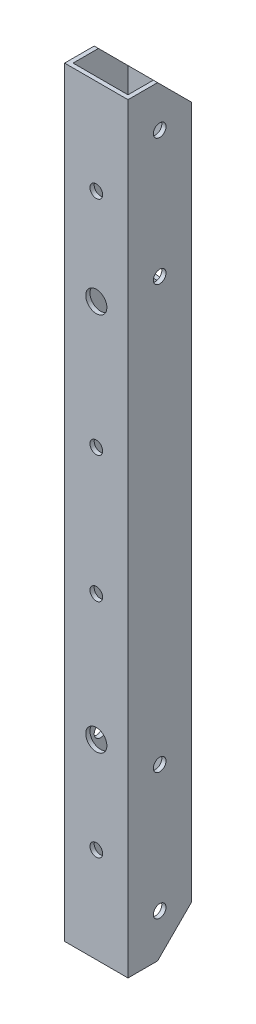
ISO-10303-21;
HEADER;
FILE_DESCRIPTION(('STEP AP214'),'2;1');
FILE_NAME('part.step','',(''),(''),'','','');
FILE_SCHEMA(('AUTOMOTIVE_DESIGN { 1 0 10303 214 1 1 1 1 }'));
ENDSEC;
DATA;
#1=APPLICATION_CONTEXT('core data for automotive mechanical design processes');
#2=APPLICATION_PROTOCOL_DEFINITION('international standard','automotive_design',2000,#1);
#3=PRODUCT_CONTEXT('',#1,'mechanical');
#4=PRODUCT('Part','Part','',(#3));
#5=PRODUCT_RELATED_PRODUCT_CATEGORY('part','',(#4));
#6=PRODUCT_DEFINITION_FORMATION('','',#4);
#7=PRODUCT_DEFINITION_CONTEXT('part definition',#1,'design');
#8=PRODUCT_DEFINITION('design','',#6,#7);
#9=PRODUCT_DEFINITION_SHAPE('','',#8);
#10=(LENGTH_UNIT() NAMED_UNIT(*) SI_UNIT(.MILLI.,.METRE.));
#11=(NAMED_UNIT(*) PLANE_ANGLE_UNIT() SI_UNIT($,.RADIAN.));
#12=(NAMED_UNIT(*) SI_UNIT($,.STERADIAN.) SOLID_ANGLE_UNIT());
#13=UNCERTAINTY_MEASURE_WITH_UNIT(LENGTH_MEASURE(1.E-05),#10,'distance_accuracy_value','');
#14=(GEOMETRIC_REPRESENTATION_CONTEXT(3) GLOBAL_UNCERTAINTY_ASSIGNED_CONTEXT((#13)) GLOBAL_UNIT_ASSIGNED_CONTEXT((#10,
#11,#12)) REPRESENTATION_CONTEXT('',''));
#15=CARTESIAN_POINT('',(0.,0.,0.));
#16=DIRECTION('',(0.,0.,1.));
#17=DIRECTION('',(1.,0.,0.));
#18=AXIS2_PLACEMENT_3D('',#15,#16,#17);
#19=CARTESIAN_POINT('',(0.,180.,0.));
#20=DIRECTION('',(0.,-1.,0.));
#21=DIRECTION('',(0.,0.,-1.));
#22=AXIS2_PLACEMENT_3D('',#19,#20,#21);
#23=PLANE('',#22);
#24=DIRECTION('',(0.,0.,-1.));
#25=VECTOR('',#24,1.);
#26=CARTESIAN_POINT('',(7.5,180.,7.5));
#27=LINE('',#26,#25);
#28=CARTESIAN_POINT('',(7.5,180.,7.5));
#29=VERTEX_POINT('',#28);
#30=CARTESIAN_POINT('',(7.5,180.,0.500000000000093));
#31=VERTEX_POINT('',#30);
#32=EDGE_CURVE('E288',#29,#31,#27,.T.);
#33=ORIENTED_EDGE('',*,*,#32,.T.);
#34=DIRECTION('',(1.,0.,0.));
#35=VECTOR('',#34,1.);
#36=CARTESIAN_POINT('',(-7.5,180.,0.500000000000093));
#37=LINE('',#36,#35);
#38=CARTESIAN_POINT('',(6.5,180.,0.500000000000093));
#39=VERTEX_POINT('',#38);
#40=EDGE_CURVE('E133',#39,#31,#37,.T.);
#41=ORIENTED_EDGE('',*,*,#40,.F.);
#42=DIRECTION('',(0.,0.,-1.));
#43=VECTOR('',#42,1.);
#44=CARTESIAN_POINT('',(6.5,180.,6.5));
#45=LINE('',#44,#43);
#46=CARTESIAN_POINT('',(6.5,180.,6.5));
#47=VERTEX_POINT('',#46);
#48=EDGE_CURVE('E267',#47,#39,#45,.T.);
#49=ORIENTED_EDGE('',*,*,#48,.F.);
#50=DIRECTION('',(1.,0.,0.));
#51=VECTOR('',#50,1.);
#52=CARTESIAN_POINT('',(-6.5,180.,6.5));
#53=LINE('',#52,#51);
#54=CARTESIAN_POINT('',(-6.5,180.,6.5));
#55=VERTEX_POINT('',#54);
#56=EDGE_CURVE('E264',#55,#47,#53,.T.);
#57=ORIENTED_EDGE('',*,*,#56,.F.);
#58=DIRECTION('',(0.,0.,1.));
#59=VECTOR('',#58,1.);
#60=CARTESIAN_POINT('',(-6.5,180.,6.5));
#61=LINE('',#60,#59);
#62=CARTESIAN_POINT('',(-6.5,180.,0.500000000000093));
#63=VERTEX_POINT('',#62);
#64=EDGE_CURVE('E262',#63,#55,#61,.T.);
#65=ORIENTED_EDGE('',*,*,#64,.F.);
#66=CARTESIAN_POINT('',(-7.5,180.,0.500000000000093));
#67=VERTEX_POINT('',#66);
#68=EDGE_CURVE('E330',#67,#63,#37,.T.);
#69=ORIENTED_EDGE('',*,*,#68,.F.);
#70=DIRECTION('',(0.,0.,1.));
#71=VECTOR('',#70,1.);
#72=CARTESIAN_POINT('',(-7.5,180.,7.5));
#73=LINE('',#72,#71);
#74=CARTESIAN_POINT('',(-7.5,180.,7.5));
#75=VERTEX_POINT('',#74);
#76=EDGE_CURVE('E142',#67,#75,#73,.T.);
#77=ORIENTED_EDGE('',*,*,#76,.T.);
#78=DIRECTION('',(1.,0.,0.));
#79=VECTOR('',#78,1.);
#80=CARTESIAN_POINT('',(-7.5,180.,7.5));
#81=LINE('',#80,#79);
#82=EDGE_CURVE('E293',#75,#29,#81,.T.);
#83=ORIENTED_EDGE('',*,*,#82,.T.);
#84=EDGE_LOOP('',(#33,#41,#49,#57,#65,#69,#77,#83));
#85=FACE_BOUND('',#84,.T.);
#86=ADVANCED_FACE('F34',(#85),#23,.F.);
#87=CARTESIAN_POINT('',(0.,0.,0.));
#88=DIRECTION('',(0.,-1.,0.));
#89=DIRECTION('',(0.,0.,-1.));
#90=AXIS2_PLACEMENT_3D('',#87,#88,#89);
#91=PLANE('',#90);
#92=DIRECTION('',(1.,0.,0.));
#93=VECTOR('',#92,1.);
#94=CARTESIAN_POINT('',(-7.5,0.,0.500000000000101));
#95=LINE('',#94,#93);
#96=CARTESIAN_POINT('',(6.5,0.,0.500000000000101));
#97=VERTEX_POINT('',#96);
#98=CARTESIAN_POINT('',(7.5,0.,0.500000000000101));
#99=VERTEX_POINT('',#98);
#100=EDGE_CURVE('E312',#97,#99,#95,.T.);
#101=ORIENTED_EDGE('',*,*,#100,.T.);
#102=DIRECTION('',(0.,0.,-1.));
#103=VECTOR('',#102,1.);
#104=CARTESIAN_POINT('',(7.5,0.,7.5));
#105=LINE('',#104,#103);
#106=CARTESIAN_POINT('',(7.5,0.,7.5));
#107=VERTEX_POINT('',#106);
#108=EDGE_CURVE('E287',#107,#99,#105,.T.);
#109=ORIENTED_EDGE('',*,*,#108,.F.);
#110=DIRECTION('',(1.,0.,0.));
#111=VECTOR('',#110,1.);
#112=CARTESIAN_POINT('',(-7.5,0.,7.5));
#113=LINE('',#112,#111);
#114=CARTESIAN_POINT('',(-7.5,0.,7.5));
#115=VERTEX_POINT('',#114);
#116=EDGE_CURVE('E291',#115,#107,#113,.T.);
#117=ORIENTED_EDGE('',*,*,#116,.F.);
#118=DIRECTION('',(0.,0.,1.));
#119=VECTOR('',#118,1.);
#120=CARTESIAN_POINT('',(-7.5,0.,7.5));
#121=LINE('',#120,#119);
#122=CARTESIAN_POINT('',(-7.5,0.,0.500000000000101));
#123=VERTEX_POINT('',#122);
#124=EDGE_CURVE('E297',#123,#115,#121,.T.);
#125=ORIENTED_EDGE('',*,*,#124,.F.);
#126=CARTESIAN_POINT('',(-6.5,0.,0.500000000000101));
#127=VERTEX_POINT('',#126);
#128=EDGE_CURVE('E314',#123,#127,#95,.T.);
#129=ORIENTED_EDGE('',*,*,#128,.T.);
#130=DIRECTION('',(0.,0.,1.));
#131=VECTOR('',#130,1.);
#132=CARTESIAN_POINT('',(-6.5,0.,6.5));
#133=LINE('',#132,#131);
#134=CARTESIAN_POINT('',(-6.5,0.,6.5));
#135=VERTEX_POINT('',#134);
#136=EDGE_CURVE('E261',#127,#135,#133,.T.);
#137=ORIENTED_EDGE('',*,*,#136,.T.);
#138=DIRECTION('',(1.,0.,0.));
#139=VECTOR('',#138,1.);
#140=CARTESIAN_POINT('',(-6.5,0.,6.5));
#141=LINE('',#140,#139);
#142=CARTESIAN_POINT('',(6.5,0.,6.5));
#143=VERTEX_POINT('',#142);
#144=EDGE_CURVE('E272',#135,#143,#141,.T.);
#145=ORIENTED_EDGE('',*,*,#144,.T.);
#146=DIRECTION('',(0.,0.,-1.));
#147=VECTOR('',#146,1.);
#148=CARTESIAN_POINT('',(6.5,0.,6.5));
#149=LINE('',#148,#147);
#150=EDGE_CURVE('E265',#143,#97,#149,.T.);
#151=ORIENTED_EDGE('',*,*,#150,.T.);
#152=EDGE_LOOP('',(#101,#109,#117,#125,#129,#137,#145,#151));
#153=FACE_BOUND('',#152,.T.);
#154=ADVANCED_FACE('F310',(#153),#91,.T.);
#155=CARTESIAN_POINT('',(7.5,180.,7.5));
#156=DIRECTION('',(-1.,0.,0.));
#157=DIRECTION('',(0.,0.,1.));
#158=AXIS2_PLACEMENT_3D('',#155,#156,#157);
#159=PLANE('',#158);
#160=CARTESIAN_POINT('',(7.5,40.,0.));
#161=DIRECTION('',(1.,0.,0.));
#162=DIRECTION('',(0.,0.,1.));
#163=AXIS2_PLACEMENT_3D('',#160,#161,#162);
#164=CIRCLE('',#163,1.5);
#165=CARTESIAN_POINT('',(7.5,40.,1.5));
#166=VERTEX_POINT('',#165);
#167=EDGE_CURVE('E327',#166,#166,#164,.T.);
#168=ORIENTED_EDGE('',*,*,#167,.F.);
#169=EDGE_LOOP('',(#168));
#170=FACE_BOUND('',#169,.T.);
#171=CARTESIAN_POINT('',(7.5,10.,0.));
#172=DIRECTION('',(1.,0.,0.));
#173=DIRECTION('',(0.,0.,1.));
#174=AXIS2_PLACEMENT_3D('',#171,#172,#173);
#175=CIRCLE('',#174,1.5);
#176=CARTESIAN_POINT('',(7.5,10.,1.5));
#177=VERTEX_POINT('',#176);
#178=EDGE_CURVE('E326',#177,#177,#175,.T.);
#179=ORIENTED_EDGE('',*,*,#178,.F.);
#180=EDGE_LOOP('',(#179));
#181=FACE_BOUND('',#180,.T.);
#182=CARTESIAN_POINT('',(7.5,140.,0.));
#183=DIRECTION('',(1.,0.,0.));
#184=DIRECTION('',(0.,0.,-1.));
#185=AXIS2_PLACEMENT_3D('',#182,#183,#184);
#186=CIRCLE('',#185,1.5);
#187=CARTESIAN_POINT('',(7.5,140.,-1.50000000000001));
#188=VERTEX_POINT('',#187);
#189=EDGE_CURVE('E334',#188,#188,#186,.T.);
#190=ORIENTED_EDGE('',*,*,#189,.F.);
#191=EDGE_LOOP('',(#190));
#192=FACE_BOUND('',#191,.T.);
#193=CARTESIAN_POINT('',(7.5,170.,0.));
#194=DIRECTION('',(1.,0.,0.));
#195=DIRECTION('',(0.,0.,-1.));
#196=AXIS2_PLACEMENT_3D('',#193,#194,#195);
#197=CIRCLE('',#196,1.5);
#198=CARTESIAN_POINT('',(7.5,170.,-1.50000000000001));
#199=VERTEX_POINT('',#198);
#200=EDGE_CURVE('E208',#199,#199,#197,.T.);
#201=ORIENTED_EDGE('',*,*,#200,.F.);
#202=EDGE_LOOP('',(#201));
#203=FACE_BOUND('',#202,.T.);
#204=DIRECTION('',(0.,-1.,0.));
#205=VECTOR('',#204,1.);
#206=CARTESIAN_POINT('',(7.5,180.,-7.5));
#207=LINE('',#206,#205);
#208=CARTESIAN_POINT('',(7.5,172.,-7.5));
#209=VERTEX_POINT('',#208);
#210=CARTESIAN_POINT('',(7.5,8.00000000000001,-7.5));
#211=VERTEX_POINT('',#210);
#212=EDGE_CURVE('E147',#209,#211,#207,.T.);
#213=ORIENTED_EDGE('',*,*,#212,.F.);
#214=DIRECTION('',(0.,-0.707106781186544,-0.707106781186551));
#215=VECTOR('',#214,1.);
#216=CARTESIAN_POINT('',(7.5,180.,0.500000000000093));
#217=LINE('',#216,#215);
#218=EDGE_CURVE('E128',#31,#209,#217,.T.);
#219=ORIENTED_EDGE('',*,*,#218,.F.);
#220=ORIENTED_EDGE('',*,*,#32,.F.);
#221=DIRECTION('',(0.,-1.,0.));
#222=VECTOR('',#221,1.);
#223=CARTESIAN_POINT('',(7.5,180.,7.5));
#224=LINE('',#223,#222);
#225=EDGE_CURVE('E152',#29,#107,#224,.T.);
#226=ORIENTED_EDGE('',*,*,#225,.T.);
#227=ORIENTED_EDGE('',*,*,#108,.T.);
#228=DIRECTION('',(0.,-0.707106781186543,0.707106781186552));
#229=VECTOR('',#228,1.);
#230=CARTESIAN_POINT('',(7.5,0.,0.500000000000101));
#231=LINE('',#230,#229);
#232=EDGE_CURVE('E320',#211,#99,#231,.T.);
#233=ORIENTED_EDGE('',*,*,#232,.F.);
#234=EDGE_LOOP('',(#213,#219,#220,#226,#227,#233));
#235=FACE_BOUND('',#234,.T.);
#236=ADVANCED_FACE('F36',(#170,#181,#192,#203,#235),#159,.F.);
#237=CARTESIAN_POINT('',(-7.5,180.,-7.5));
#238=DIRECTION('',(0.,0.,1.));
#239=DIRECTION('',(1.,0.,0.));
#240=AXIS2_PLACEMENT_3D('',#237,#238,#239);
#241=PLANE('',#240);
#242=CARTESIAN_POINT('',(0.,75.,-7.5));
#243=DIRECTION('',(0.,0.,1.));
#244=DIRECTION('',(1.,0.,0.));
#245=AXIS2_PLACEMENT_3D('',#242,#243,#244);
#246=CIRCLE('',#245,1.5);
#247=CARTESIAN_POINT('',(1.50000000000001,75.,-7.5));
#248=VERTEX_POINT('',#247);
#249=EDGE_CURVE('E229',#248,#248,#246,.T.);
#250=ORIENTED_EDGE('',*,*,#249,.T.);
#251=EDGE_LOOP('',(#250));
#252=FACE_BOUND('',#251,.T.);
#253=CARTESIAN_POINT('',(0.,105.,-7.5));
#254=DIRECTION('',(0.,0.,1.));
#255=DIRECTION('',(1.,0.,0.));
#256=AXIS2_PLACEMENT_3D('',#253,#254,#255);
#257=CIRCLE('',#256,1.5);
#258=CARTESIAN_POINT('',(1.50000000000001,105.,-7.5));
#259=VERTEX_POINT('',#258);
#260=EDGE_CURVE('E223',#259,#259,#257,.T.);
#261=ORIENTED_EDGE('',*,*,#260,.T.);
#262=EDGE_LOOP('',(#261));
#263=FACE_BOUND('',#262,.T.);
#264=CARTESIAN_POINT('',(0.,22.5,-7.5));
#265=DIRECTION('',(0.,0.,1.));
#266=DIRECTION('',(-1.,0.,0.));
#267=AXIS2_PLACEMENT_3D('',#264,#265,#266);
#268=CIRCLE('',#267,1.5);
#269=CARTESIAN_POINT('',(-1.49999999999998,22.5,-7.5));
#270=VERTEX_POINT('',#269);
#271=EDGE_CURVE('E216',#270,#270,#268,.T.);
#272=ORIENTED_EDGE('',*,*,#271,.T.);
#273=EDGE_LOOP('',(#272));
#274=FACE_BOUND('',#273,.T.);
#275=CARTESIAN_POINT('',(0.,157.5,-7.5));
#276=DIRECTION('',(0.,0.,1.));
#277=DIRECTION('',(1.,0.,0.));
#278=AXIS2_PLACEMENT_3D('',#275,#276,#277);
#279=CIRCLE('',#278,1.5);
#280=CARTESIAN_POINT('',(1.50000000000002,157.5,-7.5));
#281=VERTEX_POINT('',#280);
#282=EDGE_CURVE('E239',#281,#281,#279,.T.);
#283=ORIENTED_EDGE('',*,*,#282,.T.);
#284=EDGE_LOOP('',(#283));
#285=FACE_BOUND('',#284,.T.);
#286=CARTESIAN_POINT('',(0.,45.0987193946542,-7.5));
#287=DIRECTION('',(0.,0.,1.));
#288=DIRECTION('',(1.,0.,0.));
#289=AXIS2_PLACEMENT_3D('',#286,#287,#288);
#290=CIRCLE('',#289,2.5);
#291=CARTESIAN_POINT('',(2.49999999999999,45.0987193946542,-7.5));
#292=VERTEX_POINT('',#291);
#293=EDGE_CURVE('E165',#292,#292,#290,.T.);
#294=ORIENTED_EDGE('',*,*,#293,.T.);
#295=EDGE_LOOP('',(#294));
#296=FACE_BOUND('',#295,.T.);
#297=CARTESIAN_POINT('',(0.,134.901280605346,-7.5));
#298=DIRECTION('',(0.,0.,1.));
#299=DIRECTION('',(1.,0.,0.));
#300=AXIS2_PLACEMENT_3D('',#297,#298,#299);
#301=CIRCLE('',#300,2.5);
#302=CARTESIAN_POINT('',(2.49999999999999,134.901280605346,-7.5));
#303=VERTEX_POINT('',#302);
#304=EDGE_CURVE('E160',#303,#303,#301,.T.);
#305=ORIENTED_EDGE('',*,*,#304,.T.);
#306=EDGE_LOOP('',(#305));
#307=FACE_BOUND('',#306,.T.);
#308=DIRECTION('',(0.,-1.,0.));
#309=VECTOR('',#308,1.);
#310=CARTESIAN_POINT('',(-7.5,180.,-7.5));
#311=LINE('',#310,#309);
#312=CARTESIAN_POINT('',(-7.5,172.,-7.5));
#313=VERTEX_POINT('',#312);
#314=CARTESIAN_POINT('',(-7.5,8.00000000000001,-7.5));
#315=VERTEX_POINT('',#314);
#316=EDGE_CURVE('E140',#313,#315,#311,.T.);
#317=ORIENTED_EDGE('',*,*,#316,.F.);
#318=DIRECTION('',(1.,0.,0.));
#319=VECTOR('',#318,1.);
#320=CARTESIAN_POINT('',(-7.5,172.,-7.5));
#321=LINE('',#320,#319);
#322=EDGE_CURVE('E122',#313,#209,#321,.T.);
#323=ORIENTED_EDGE('',*,*,#322,.T.);
#324=ORIENTED_EDGE('',*,*,#212,.T.);
#325=DIRECTION('',(1.,0.,0.));
#326=VECTOR('',#325,1.);
#327=CARTESIAN_POINT('',(-7.5,8.00000000000001,-7.5));
#328=LINE('',#327,#326);
#329=EDGE_CURVE('E146',#315,#211,#328,.T.);
#330=ORIENTED_EDGE('',*,*,#329,.F.);
#331=EDGE_LOOP('',(#317,#323,#324,#330));
#332=FACE_BOUND('',#331,.T.);
#333=ADVANCED_FACE('F145',(#252,#263,#274,#285,#296,#307,#332),#241,.F.);
#334=CARTESIAN_POINT('',(-7.5,180.,7.5));
#335=DIRECTION('',(1.,0.,0.));
#336=DIRECTION('',(0.,0.,-1.));
#337=AXIS2_PLACEMENT_3D('',#334,#335,#336);
#338=PLANE('',#337);
#339=CARTESIAN_POINT('',(-7.5,40.,0.));
#340=DIRECTION('',(1.,0.,0.));
#341=DIRECTION('',(0.,0.,1.));
#342=AXIS2_PLACEMENT_3D('',#339,#340,#341);
#343=CIRCLE('',#342,1.5);
#344=CARTESIAN_POINT('',(-7.5,40.,1.5));
#345=VERTEX_POINT('',#344);
#346=EDGE_CURVE('E323',#345,#345,#343,.T.);
#347=ORIENTED_EDGE('',*,*,#346,.T.);
#348=EDGE_LOOP('',(#347));
#349=FACE_BOUND('',#348,.T.);
#350=CARTESIAN_POINT('',(-7.5,10.,0.));
#351=DIRECTION('',(1.,0.,0.));
#352=DIRECTION('',(0.,0.,1.));
#353=AXIS2_PLACEMENT_3D('',#350,#351,#352);
#354=CIRCLE('',#353,1.5);
#355=CARTESIAN_POINT('',(-7.5,10.,1.5));
#356=VERTEX_POINT('',#355);
#357=EDGE_CURVE('E337',#356,#356,#354,.T.);
#358=ORIENTED_EDGE('',*,*,#357,.T.);
#359=EDGE_LOOP('',(#358));
#360=FACE_BOUND('',#359,.T.);
#361=CARTESIAN_POINT('',(-7.5,140.,0.));
#362=DIRECTION('',(1.,0.,0.));
#363=DIRECTION('',(0.,0.,-1.));
#364=AXIS2_PLACEMENT_3D('',#361,#362,#363);
#365=CIRCLE('',#364,1.5);
#366=CARTESIAN_POINT('',(-7.5,140.,-1.50000000000001));
#367=VERTEX_POINT('',#366);
#368=EDGE_CURVE('E331',#367,#367,#365,.T.);
#369=ORIENTED_EDGE('',*,*,#368,.T.);
#370=EDGE_LOOP('',(#369));
#371=FACE_BOUND('',#370,.T.);
#372=CARTESIAN_POINT('',(-7.5,170.,0.));
#373=DIRECTION('',(1.,0.,0.));
#374=DIRECTION('',(0.,0.,-1.));
#375=AXIS2_PLACEMENT_3D('',#372,#373,#374);
#376=CIRCLE('',#375,1.5);
#377=CARTESIAN_POINT('',(-7.5,170.,-1.50000000000001));
#378=VERTEX_POINT('',#377);
#379=EDGE_CURVE('E186',#378,#378,#376,.T.);
#380=ORIENTED_EDGE('',*,*,#379,.T.);
#381=EDGE_LOOP('',(#380));
#382=FACE_BOUND('',#381,.T.);
#383=ORIENTED_EDGE('',*,*,#76,.F.);
#384=DIRECTION('',(0.,-0.707106781186544,-0.707106781186551));
#385=VECTOR('',#384,1.);
#386=CARTESIAN_POINT('',(-7.5,180.,0.500000000000093));
#387=LINE('',#386,#385);
#388=EDGE_CURVE('E125',#67,#313,#387,.T.);
#389=ORIENTED_EDGE('',*,*,#388,.T.);
#390=ORIENTED_EDGE('',*,*,#316,.T.);
#391=DIRECTION('',(0.,-0.707106781186543,0.707106781186552));
#392=VECTOR('',#391,1.);
#393=CARTESIAN_POINT('',(-7.5,0.,0.500000000000101));
#394=LINE('',#393,#392);
#395=EDGE_CURVE('E317',#315,#123,#394,.T.);
#396=ORIENTED_EDGE('',*,*,#395,.T.);
#397=ORIENTED_EDGE('',*,*,#124,.T.);
#398=DIRECTION('',(0.,-1.,0.));
#399=VECTOR('',#398,1.);
#400=CARTESIAN_POINT('',(-7.5,180.,7.5));
#401=LINE('',#400,#399);
#402=EDGE_CURVE('E148',#75,#115,#401,.T.);
#403=ORIENTED_EDGE('',*,*,#402,.F.);
#404=EDGE_LOOP('',(#383,#389,#390,#396,#397,#403));
#405=FACE_BOUND('',#404,.T.);
#406=ADVANCED_FACE('F138',(#349,#360,#371,#382,#405),#338,.F.);
#407=CARTESIAN_POINT('',(-7.5,180.,7.5));
#408=DIRECTION('',(0.,0.,-1.));
#409=DIRECTION('',(-1.,0.,0.));
#410=AXIS2_PLACEMENT_3D('',#407,#408,#409);
#411=PLANE('',#410);
#412=CARTESIAN_POINT('',(0.,75.,7.5));
#413=DIRECTION('',(0.,0.,1.));
#414=DIRECTION('',(1.,0.,0.));
#415=AXIS2_PLACEMENT_3D('',#412,#413,#414);
#416=CIRCLE('',#415,1.5);
#417=CARTESIAN_POINT('',(1.50000000000001,75.,7.5));
#418=VERTEX_POINT('',#417);
#419=EDGE_CURVE('E215',#418,#418,#416,.T.);
#420=ORIENTED_EDGE('',*,*,#419,.F.);
#421=EDGE_LOOP('',(#420));
#422=FACE_BOUND('',#421,.T.);
#423=CARTESIAN_POINT('',(0.,105.,7.5));
#424=DIRECTION('',(0.,0.,1.));
#425=DIRECTION('',(1.,0.,0.));
#426=AXIS2_PLACEMENT_3D('',#423,#424,#425);
#427=CIRCLE('',#426,1.5);
#428=CARTESIAN_POINT('',(1.50000000000001,105.,7.5));
#429=VERTEX_POINT('',#428);
#430=EDGE_CURVE('E226',#429,#429,#427,.T.);
#431=ORIENTED_EDGE('',*,*,#430,.F.);
#432=EDGE_LOOP('',(#431));
#433=FACE_BOUND('',#432,.T.);
#434=CARTESIAN_POINT('',(0.,22.5,7.5));
#435=DIRECTION('',(0.,0.,1.));
#436=DIRECTION('',(-1.,0.,0.));
#437=AXIS2_PLACEMENT_3D('',#434,#435,#436);
#438=CIRCLE('',#437,1.5);
#439=CARTESIAN_POINT('',(-1.49999999999998,22.5,7.5));
#440=VERTEX_POINT('',#439);
#441=EDGE_CURVE('E220',#440,#440,#438,.T.);
#442=ORIENTED_EDGE('',*,*,#441,.F.);
#443=EDGE_LOOP('',(#442));
#444=FACE_BOUND('',#443,.T.);
#445=CARTESIAN_POINT('',(0.,157.5,7.5));
#446=DIRECTION('',(0.,0.,1.));
#447=DIRECTION('',(1.,0.,0.));
#448=AXIS2_PLACEMENT_3D('',#445,#446,#447);
#449=CIRCLE('',#448,1.5);
#450=CARTESIAN_POINT('',(1.50000000000002,157.5,7.5));
#451=VERTEX_POINT('',#450);
#452=EDGE_CURVE('E219',#451,#451,#449,.T.);
#453=ORIENTED_EDGE('',*,*,#452,.F.);
#454=EDGE_LOOP('',(#453));
#455=FACE_BOUND('',#454,.T.);
#456=CARTESIAN_POINT('',(0.,45.0987193946542,7.5));
#457=DIRECTION('',(0.,0.,1.));
#458=DIRECTION('',(1.,0.,0.));
#459=AXIS2_PLACEMENT_3D('',#456,#457,#458);
#460=CIRCLE('',#459,2.5);
#461=CARTESIAN_POINT('',(2.49999999999999,45.0987193946542,7.5));
#462=VERTEX_POINT('',#461);
#463=EDGE_CURVE('E236',#462,#462,#460,.T.);
#464=ORIENTED_EDGE('',*,*,#463,.F.);
#465=EDGE_LOOP('',(#464));
#466=FACE_BOUND('',#465,.T.);
#467=CARTESIAN_POINT('',(0.,134.901280605346,7.5));
#468=DIRECTION('',(0.,0.,1.));
#469=DIRECTION('',(1.,0.,0.));
#470=AXIS2_PLACEMENT_3D('',#467,#468,#469);
#471=CIRCLE('',#470,2.5);
#472=CARTESIAN_POINT('',(2.49999999999999,134.901280605346,7.5));
#473=VERTEX_POINT('',#472);
#474=EDGE_CURVE('E254',#473,#473,#471,.T.);
#475=ORIENTED_EDGE('',*,*,#474,.F.);
#476=EDGE_LOOP('',(#475));
#477=FACE_BOUND('',#476,.T.);
#478=ORIENTED_EDGE('',*,*,#116,.T.);
#479=ORIENTED_EDGE('',*,*,#225,.F.);
#480=ORIENTED_EDGE('',*,*,#82,.F.);
#481=ORIENTED_EDGE('',*,*,#402,.T.);
#482=EDGE_LOOP('',(#478,#479,#480,#481));
#483=FACE_BOUND('',#482,.T.);
#484=ADVANCED_FACE('F371',(#422,#433,#444,#455,#466,#477,#483),#411,.F.);
#485=CARTESIAN_POINT('',(-6.5,180.,6.5));
#486=DIRECTION('',(1.,0.,0.));
#487=DIRECTION('',(0.,0.,-1.));
#488=AXIS2_PLACEMENT_3D('',#485,#486,#487);
#489=PLANE('',#488);
#490=CARTESIAN_POINT('',(-6.5,40.,0.));
#491=DIRECTION('',(1.,0.,0.));
#492=DIRECTION('',(0.,0.,-1.));
#493=AXIS2_PLACEMENT_3D('',#490,#491,#492);
#494=CIRCLE('',#493,1.5);
#495=CARTESIAN_POINT('',(-6.5,40.,-1.50000000000001));
#496=VERTEX_POINT('',#495);
#497=EDGE_CURVE('E205',#496,#496,#494,.T.);
#498=ORIENTED_EDGE('',*,*,#497,.F.);
#499=EDGE_LOOP('',(#498));
#500=FACE_BOUND('',#499,.T.);
#501=DIRECTION('',(0.,-0.707106781186544,-0.707106781186551));
#502=VECTOR('',#501,1.);
#503=CARTESIAN_POINT('',(-6.5,183.,3.50000000000008));
#504=LINE('',#503,#502);
#505=CARTESIAN_POINT('',(-6.5,173.,-6.5));
#506=VERTEX_POINT('',#505);
#507=EDGE_CURVE('E50',#63,#506,#504,.T.);
#508=ORIENTED_EDGE('',*,*,#507,.F.);
#509=ORIENTED_EDGE('',*,*,#64,.T.);
#510=DIRECTION('',(0.,-1.,0.));
#511=VECTOR('',#510,1.);
#512=CARTESIAN_POINT('',(-6.5,180.,6.5));
#513=LINE('',#512,#511);
#514=EDGE_CURVE('E284',#55,#135,#513,.T.);
#515=ORIENTED_EDGE('',*,*,#514,.T.);
#516=ORIENTED_EDGE('',*,*,#136,.F.);
#517=DIRECTION('',(0.,-0.707106781186543,0.707106781186552));
#518=VECTOR('',#517,1.);
#519=CARTESIAN_POINT('',(-6.5,86.999999999999,-86.4999999999999));
#520=LINE('',#519,#518);
#521=CARTESIAN_POINT('',(-6.5,7.00000000000001,-6.5));
#522=VERTEX_POINT('',#521);
#523=EDGE_CURVE('E343',#522,#127,#520,.T.);
#524=ORIENTED_EDGE('',*,*,#523,.F.);
#525=DIRECTION('',(0.,-1.,0.));
#526=VECTOR('',#525,1.);
#527=CARTESIAN_POINT('',(-6.5,180.,-6.5));
#528=LINE('',#527,#526);
#529=EDGE_CURVE('E270',#506,#522,#528,.T.);
#530=ORIENTED_EDGE('',*,*,#529,.F.);
#531=EDGE_LOOP('',(#508,#509,#515,#516,#524,#530));
#532=FACE_BOUND('',#531,.T.);
#533=CARTESIAN_POINT('',(-6.5,10.,0.));
#534=DIRECTION('',(1.,0.,0.));
#535=DIRECTION('',(0.,0.,-1.));
#536=AXIS2_PLACEMENT_3D('',#533,#534,#535);
#537=CIRCLE('',#536,1.5);
#538=CARTESIAN_POINT('',(-6.5,10.,-1.5));
#539=VERTEX_POINT('',#538);
#540=EDGE_CURVE('E193',#539,#539,#537,.T.);
#541=ORIENTED_EDGE('',*,*,#540,.F.);
#542=EDGE_LOOP('',(#541));
#543=FACE_BOUND('',#542,.T.);
#544=CARTESIAN_POINT('',(-6.5,140.,0.));
#545=DIRECTION('',(1.,0.,0.));
#546=DIRECTION('',(0.,0.,-1.));
#547=AXIS2_PLACEMENT_3D('',#544,#545,#546);
#548=CIRCLE('',#547,1.5);
#549=CARTESIAN_POINT('',(-6.5,140.,-1.50000000000001));
#550=VERTEX_POINT('',#549);
#551=EDGE_CURVE('E190',#550,#550,#548,.T.);
#552=ORIENTED_EDGE('',*,*,#551,.F.);
#553=EDGE_LOOP('',(#552));
#554=FACE_BOUND('',#553,.T.);
#555=CARTESIAN_POINT('',(-6.5,170.,0.));
#556=DIRECTION('',(1.,0.,0.));
#557=DIRECTION('',(0.,0.,-1.));
#558=AXIS2_PLACEMENT_3D('',#555,#556,#557);
#559=CIRCLE('',#558,1.5);
#560=CARTESIAN_POINT('',(-6.5,170.,-1.50000000000001));
#561=VERTEX_POINT('',#560);
#562=EDGE_CURVE('E185',#561,#561,#559,.T.);
#563=ORIENTED_EDGE('',*,*,#562,.F.);
#564=EDGE_LOOP('',(#563));
#565=FACE_BOUND('',#564,.T.);
#566=ADVANCED_FACE('F362',(#500,#532,#543,#554,#565),#489,.T.);
#567=CARTESIAN_POINT('',(-6.5,180.,6.5));
#568=DIRECTION('',(0.,0.,-1.));
#569=DIRECTION('',(-1.,0.,0.));
#570=AXIS2_PLACEMENT_3D('',#567,#568,#569);
#571=PLANE('',#570);
#572=CARTESIAN_POINT('',(0.,75.,6.5));
#573=DIRECTION('',(0.,0.,-1.));
#574=DIRECTION('',(-1.,0.,0.));
#575=AXIS2_PLACEMENT_3D('',#572,#573,#574);
#576=CIRCLE('',#575,1.5);
#577=CARTESIAN_POINT('',(-1.49999999999999,75.,6.5));
#578=VERTEX_POINT('',#577);
#579=EDGE_CURVE('E181',#578,#578,#576,.T.);
#580=ORIENTED_EDGE('',*,*,#579,.F.);
#581=EDGE_LOOP('',(#580));
#582=FACE_BOUND('',#581,.T.);
#583=CARTESIAN_POINT('',(0.,105.,6.5));
#584=DIRECTION('',(0.,0.,-1.));
#585=DIRECTION('',(-1.,0.,0.));
#586=AXIS2_PLACEMENT_3D('',#583,#584,#585);
#587=CIRCLE('',#586,1.5);
#588=CARTESIAN_POINT('',(-1.49999999999999,105.,6.5));
#589=VERTEX_POINT('',#588);
#590=EDGE_CURVE('E177',#589,#589,#587,.T.);
#591=ORIENTED_EDGE('',*,*,#590,.F.);
#592=EDGE_LOOP('',(#591));
#593=FACE_BOUND('',#592,.T.);
#594=CARTESIAN_POINT('',(0.,22.5,6.5));
#595=DIRECTION('',(0.,0.,-1.));
#596=DIRECTION('',(-1.,0.,0.));
#597=AXIS2_PLACEMENT_3D('',#594,#595,#596);
#598=CIRCLE('',#597,1.5);
#599=CARTESIAN_POINT('',(-1.49999999999998,22.5,6.5));
#600=VERTEX_POINT('',#599);
#601=EDGE_CURVE('E173',#600,#600,#598,.T.);
#602=ORIENTED_EDGE('',*,*,#601,.F.);
#603=EDGE_LOOP('',(#602));
#604=FACE_BOUND('',#603,.T.);
#605=CARTESIAN_POINT('',(0.,157.5,6.5));
#606=DIRECTION('',(0.,0.,-1.));
#607=DIRECTION('',(-1.,0.,0.));
#608=AXIS2_PLACEMENT_3D('',#605,#606,#607);
#609=CIRCLE('',#608,1.5);
#610=CARTESIAN_POINT('',(-1.49999999999998,157.5,6.5));
#611=VERTEX_POINT('',#610);
#612=EDGE_CURVE('E169',#611,#611,#609,.T.);
#613=ORIENTED_EDGE('',*,*,#612,.F.);
#614=EDGE_LOOP('',(#613));
#615=FACE_BOUND('',#614,.T.);
#616=CARTESIAN_POINT('',(0.,45.0987193946542,6.5));
#617=DIRECTION('',(0.,0.,-1.));
#618=DIRECTION('',(-1.,0.,0.));
#619=AXIS2_PLACEMENT_3D('',#616,#617,#618);
#620=CIRCLE('',#619,2.5);
#621=CARTESIAN_POINT('',(-2.50000000000002,45.0987193946542,6.5));
#622=VERTEX_POINT('',#621);
#623=EDGE_CURVE('E164',#622,#622,#620,.T.);
#624=ORIENTED_EDGE('',*,*,#623,.F.);
#625=EDGE_LOOP('',(#624));
#626=FACE_BOUND('',#625,.T.);
#627=CARTESIAN_POINT('',(0.,134.901280605346,6.5));
#628=DIRECTION('',(0.,0.,-1.));
#629=DIRECTION('',(-1.,0.,0.));
#630=AXIS2_PLACEMENT_3D('',#627,#628,#629);
#631=CIRCLE('',#630,2.5);
#632=CARTESIAN_POINT('',(-2.50000000000002,134.901280605346,6.5));
#633=VERTEX_POINT('',#632);
#634=EDGE_CURVE('E159',#633,#633,#631,.T.);
#635=ORIENTED_EDGE('',*,*,#634,.F.);
#636=EDGE_LOOP('',(#635));
#637=FACE_BOUND('',#636,.T.);
#638=ORIENTED_EDGE('',*,*,#144,.F.);
#639=ORIENTED_EDGE('',*,*,#514,.F.);
#640=ORIENTED_EDGE('',*,*,#56,.T.);
#641=DIRECTION('',(0.,-1.,0.));
#642=VECTOR('',#641,1.);
#643=CARTESIAN_POINT('',(6.5,180.,6.5));
#644=LINE('',#643,#642);
#645=EDGE_CURVE('E282',#47,#143,#644,.T.);
#646=ORIENTED_EDGE('',*,*,#645,.T.);
#647=EDGE_LOOP('',(#638,#639,#640,#646));
#648=FACE_BOUND('',#647,.T.);
#649=ADVANCED_FACE('F358',(#582,#593,#604,#615,#626,#637,#648),#571,.T.);
#650=CARTESIAN_POINT('',(6.5,180.,6.5));
#651=DIRECTION('',(-1.,0.,0.));
#652=DIRECTION('',(0.,0.,1.));
#653=AXIS2_PLACEMENT_3D('',#650,#651,#652);
#654=PLANE('',#653);
#655=CARTESIAN_POINT('',(6.5,40.,0.));
#656=DIRECTION('',(-1.,0.,0.));
#657=DIRECTION('',(0.,0.,1.));
#658=AXIS2_PLACEMENT_3D('',#655,#656,#657);
#659=CIRCLE('',#658,1.5);
#660=CARTESIAN_POINT('',(6.5,40.,1.5));
#661=VERTEX_POINT('',#660);
#662=EDGE_CURVE('E38',#661,#661,#659,.T.);
#663=ORIENTED_EDGE('',*,*,#662,.F.);
#664=EDGE_LOOP('',(#663));
#665=FACE_BOUND('',#664,.T.);
#666=DIRECTION('',(0.,0.707106781186544,0.707106781186551));
#667=VECTOR('',#666,1.);
#668=CARTESIAN_POINT('',(6.5,183.,3.50000000000008));
#669=LINE('',#668,#667);
#670=CARTESIAN_POINT('',(6.5,173.,-6.5));
#671=VERTEX_POINT('',#670);
#672=EDGE_CURVE('E344',#671,#39,#669,.T.);
#673=ORIENTED_EDGE('',*,*,#672,.F.);
#674=DIRECTION('',(0.,-1.,0.));
#675=VECTOR('',#674,1.);
#676=CARTESIAN_POINT('',(6.5,180.,-6.5));
#677=LINE('',#676,#675);
#678=CARTESIAN_POINT('',(6.5,7.00000000000006,-6.5));
#679=VERTEX_POINT('',#678);
#680=EDGE_CURVE('E279',#671,#679,#677,.T.);
#681=ORIENTED_EDGE('',*,*,#680,.T.);
#682=DIRECTION('',(0.,0.707106781186543,-0.707106781186552));
#683=VECTOR('',#682,1.);
#684=CARTESIAN_POINT('',(6.50000000000001,86.999999999999,-86.4999999999999));
#685=LINE('',#684,#683);
#686=EDGE_CURVE('E58',#97,#679,#685,.T.);
#687=ORIENTED_EDGE('',*,*,#686,.F.);
#688=ORIENTED_EDGE('',*,*,#150,.F.);
#689=ORIENTED_EDGE('',*,*,#645,.F.);
#690=ORIENTED_EDGE('',*,*,#48,.T.);
#691=EDGE_LOOP('',(#673,#681,#687,#688,#689,#690));
#692=FACE_BOUND('',#691,.T.);
#693=CARTESIAN_POINT('',(6.5,10.,0.));
#694=DIRECTION('',(-1.,0.,0.));
#695=DIRECTION('',(0.,0.,1.));
#696=AXIS2_PLACEMENT_3D('',#693,#694,#695);
#697=CIRCLE('',#696,1.5);
#698=CARTESIAN_POINT('',(6.5,10.,1.5));
#699=VERTEX_POINT('',#698);
#700=EDGE_CURVE('E191',#699,#699,#697,.T.);
#701=ORIENTED_EDGE('',*,*,#700,.F.);
#702=EDGE_LOOP('',(#701));
#703=FACE_BOUND('',#702,.T.);
#704=CARTESIAN_POINT('',(6.5,140.,0.));
#705=DIRECTION('',(-1.,0.,0.));
#706=DIRECTION('',(0.,0.,1.));
#707=AXIS2_PLACEMENT_3D('',#704,#705,#706);
#708=CIRCLE('',#707,1.5);
#709=CARTESIAN_POINT('',(6.5,140.,1.5));
#710=VERTEX_POINT('',#709);
#711=EDGE_CURVE('E188',#710,#710,#708,.T.);
#712=ORIENTED_EDGE('',*,*,#711,.F.);
#713=EDGE_LOOP('',(#712));
#714=FACE_BOUND('',#713,.T.);
#715=CARTESIAN_POINT('',(6.5,170.,0.));
#716=DIRECTION('',(-1.,0.,0.));
#717=DIRECTION('',(0.,0.,1.));
#718=AXIS2_PLACEMENT_3D('',#715,#716,#717);
#719=CIRCLE('',#718,1.5);
#720=CARTESIAN_POINT('',(6.5,170.,1.5));
#721=VERTEX_POINT('',#720);
#722=EDGE_CURVE('E182',#721,#721,#719,.T.);
#723=ORIENTED_EDGE('',*,*,#722,.F.);
#724=EDGE_LOOP('',(#723));
#725=FACE_BOUND('',#724,.T.);
#726=ADVANCED_FACE('F354',(#665,#692,#703,#714,#725),#654,.T.);
#727=CARTESIAN_POINT('',(-6.5,180.,-6.5));
#728=DIRECTION('',(0.,0.,1.));
#729=DIRECTION('',(1.,0.,0.));
#730=AXIS2_PLACEMENT_3D('',#727,#728,#729);
#731=PLANE('',#730);
#732=DIRECTION('',(1.,0.,0.));
#733=VECTOR('',#732,1.);
#734=CARTESIAN_POINT('',(-6.5,173.,-6.5));
#735=LINE('',#734,#733);
#736=EDGE_CURVE('E11',#506,#671,#735,.T.);
#737=ORIENTED_EDGE('',*,*,#736,.F.);
#738=ORIENTED_EDGE('',*,*,#529,.T.);
#739=DIRECTION('',(-1.,0.,0.));
#740=VECTOR('',#739,1.);
#741=CARTESIAN_POINT('',(-6.5,7.00000000000001,-6.5));
#742=LINE('',#741,#740);
#743=EDGE_CURVE('E43',#679,#522,#742,.T.);
#744=ORIENTED_EDGE('',*,*,#743,.F.);
#745=ORIENTED_EDGE('',*,*,#680,.F.);
#746=EDGE_LOOP('',(#737,#738,#744,#745));
#747=FACE_BOUND('',#746,.T.);
#748=CARTESIAN_POINT('',(0.,75.,-6.5));
#749=DIRECTION('',(0.,0.,1.));
#750=DIRECTION('',(1.,0.,0.));
#751=AXIS2_PLACEMENT_3D('',#748,#749,#750);
#752=CIRCLE('',#751,1.5);
#753=CARTESIAN_POINT('',(1.50000000000001,75.,-6.5));
#754=VERTEX_POINT('',#753);
#755=EDGE_CURVE('E178',#754,#754,#752,.T.);
#756=ORIENTED_EDGE('',*,*,#755,.F.);
#757=EDGE_LOOP('',(#756));
#758=FACE_BOUND('',#757,.T.);
#759=CARTESIAN_POINT('',(0.,105.,-6.5));
#760=DIRECTION('',(0.,0.,1.));
#761=DIRECTION('',(1.,0.,0.));
#762=AXIS2_PLACEMENT_3D('',#759,#760,#761);
#763=CIRCLE('',#762,1.5);
#764=CARTESIAN_POINT('',(1.50000000000001,105.,-6.5));
#765=VERTEX_POINT('',#764);
#766=EDGE_CURVE('E174',#765,#765,#763,.T.);
#767=ORIENTED_EDGE('',*,*,#766,.F.);
#768=EDGE_LOOP('',(#767));
#769=FACE_BOUND('',#768,.T.);
#770=CARTESIAN_POINT('',(0.,22.5,-6.5));
#771=DIRECTION('',(0.,0.,1.));
#772=DIRECTION('',(1.,0.,0.));
#773=AXIS2_PLACEMENT_3D('',#770,#771,#772);
#774=CIRCLE('',#773,1.5);
#775=CARTESIAN_POINT('',(1.50000000000002,22.5,-6.5));
#776=VERTEX_POINT('',#775);
#777=EDGE_CURVE('E170',#776,#776,#774,.T.);
#778=ORIENTED_EDGE('',*,*,#777,.F.);
#779=EDGE_LOOP('',(#778));
#780=FACE_BOUND('',#779,.T.);
#781=CARTESIAN_POINT('',(0.,157.5,-6.5));
#782=DIRECTION('',(0.,0.,1.));
#783=DIRECTION('',(1.,0.,0.));
#784=AXIS2_PLACEMENT_3D('',#781,#782,#783);
#785=CIRCLE('',#784,1.5);
#786=CARTESIAN_POINT('',(1.50000000000002,157.5,-6.5));
#787=VERTEX_POINT('',#786);
#788=EDGE_CURVE('E166',#787,#787,#785,.T.);
#789=ORIENTED_EDGE('',*,*,#788,.F.);
#790=EDGE_LOOP('',(#789));
#791=FACE_BOUND('',#790,.T.);
#792=CARTESIAN_POINT('',(0.,45.0987193946542,-6.5));
#793=DIRECTION('',(0.,0.,1.));
#794=DIRECTION('',(1.,0.,0.));
#795=AXIS2_PLACEMENT_3D('',#792,#793,#794);
#796=CIRCLE('',#795,2.5);
#797=CARTESIAN_POINT('',(2.49999999999999,45.0987193946542,-6.5));
#798=VERTEX_POINT('',#797);
#799=EDGE_CURVE('E161',#798,#798,#796,.T.);
#800=ORIENTED_EDGE('',*,*,#799,.F.);
#801=EDGE_LOOP('',(#800));
#802=FACE_BOUND('',#801,.T.);
#803=CARTESIAN_POINT('',(0.,134.901280605346,-6.5));
#804=DIRECTION('',(0.,0.,1.));
#805=DIRECTION('',(1.,0.,0.));
#806=AXIS2_PLACEMENT_3D('',#803,#804,#805);
#807=CIRCLE('',#806,2.5);
#808=CARTESIAN_POINT('',(2.49999999999999,134.901280605346,-6.5));
#809=VERTEX_POINT('',#808);
#810=EDGE_CURVE('E156',#809,#809,#807,.T.);
#811=ORIENTED_EDGE('',*,*,#810,.F.);
#812=EDGE_LOOP('',(#811));
#813=FACE_BOUND('',#812,.T.);
#814=ADVANCED_FACE('F368',(#747,#758,#769,#780,#791,#802,#813),#731,.T.);
#815=CARTESIAN_POINT('',(0.,134.901280605346,-7.5));
#816=DIRECTION('',(0.,0.,1.));
#817=DIRECTION('',(1.,0.,0.));
#818=AXIS2_PLACEMENT_3D('',#815,#816,#817);
#819=CYLINDRICAL_SURFACE('',#818,2.5);
#820=ORIENTED_EDGE('',*,*,#810,.T.);
#821=EDGE_LOOP('',(#820));
#822=FACE_BOUND('',#821,.T.);
#823=ORIENTED_EDGE('',*,*,#304,.F.);
#824=EDGE_LOOP('',(#823));
#825=FACE_BOUND('',#824,.T.);
#826=ADVANCED_FACE('F400',(#822,#825),#819,.F.);
#827=ORIENTED_EDGE('',*,*,#634,.T.);
#828=EDGE_LOOP('',(#827));
#829=FACE_BOUND('',#828,.T.);
#830=ORIENTED_EDGE('',*,*,#474,.T.);
#831=EDGE_LOOP('',(#830));
#832=FACE_BOUND('',#831,.T.);
#833=ADVANCED_FACE('F403',(#829,#832),#819,.F.);
#834=CARTESIAN_POINT('',(0.,45.0987193946542,-7.5));
#835=DIRECTION('',(0.,0.,1.));
#836=DIRECTION('',(1.,0.,0.));
#837=AXIS2_PLACEMENT_3D('',#834,#835,#836);
#838=CYLINDRICAL_SURFACE('',#837,2.5);
#839=ORIENTED_EDGE('',*,*,#799,.T.);
#840=EDGE_LOOP('',(#839));
#841=FACE_BOUND('',#840,.T.);
#842=ORIENTED_EDGE('',*,*,#293,.F.);
#843=EDGE_LOOP('',(#842));
#844=FACE_BOUND('',#843,.T.);
#845=ADVANCED_FACE('F409',(#841,#844),#838,.F.);
#846=CARTESIAN_POINT('',(0.,157.5,-7.5));
#847=DIRECTION('',(0.,0.,1.));
#848=DIRECTION('',(1.,0.,0.));
#849=AXIS2_PLACEMENT_3D('',#846,#847,#848);
#850=CYLINDRICAL_SURFACE('',#849,1.5);
#851=ORIENTED_EDGE('',*,*,#788,.T.);
#852=EDGE_LOOP('',(#851));
#853=FACE_BOUND('',#852,.T.);
#854=ORIENTED_EDGE('',*,*,#282,.F.);
#855=EDGE_LOOP('',(#854));
#856=FACE_BOUND('',#855,.T.);
#857=ADVANCED_FACE('F405',(#853,#856),#850,.F.);
#858=CARTESIAN_POINT('',(0.,22.5,-7.5));
#859=DIRECTION('',(0.,0.,1.));
#860=DIRECTION('',(1.,0.,0.));
#861=AXIS2_PLACEMENT_3D('',#858,#859,#860);
#862=CYLINDRICAL_SURFACE('',#861,1.5);
#863=ORIENTED_EDGE('',*,*,#777,.T.);
#864=EDGE_LOOP('',(#863));
#865=FACE_BOUND('',#864,.T.);
#866=ORIENTED_EDGE('',*,*,#271,.F.);
#867=EDGE_LOOP('',(#866));
#868=FACE_BOUND('',#867,.T.);
#869=ADVANCED_FACE('F408',(#865,#868),#862,.F.);
#870=CARTESIAN_POINT('',(0.,105.,-7.5));
#871=DIRECTION('',(0.,0.,1.));
#872=DIRECTION('',(1.,0.,0.));
#873=AXIS2_PLACEMENT_3D('',#870,#871,#872);
#874=CYLINDRICAL_SURFACE('',#873,1.5);
#875=ORIENTED_EDGE('',*,*,#766,.T.);
#876=EDGE_LOOP('',(#875));
#877=FACE_BOUND('',#876,.T.);
#878=ORIENTED_EDGE('',*,*,#260,.F.);
#879=EDGE_LOOP('',(#878));
#880=FACE_BOUND('',#879,.T.);
#881=ADVANCED_FACE('F419',(#877,#880),#874,.F.);
#882=CARTESIAN_POINT('',(0.,75.,-7.5));
#883=DIRECTION('',(0.,0.,1.));
#884=DIRECTION('',(1.,0.,0.));
#885=AXIS2_PLACEMENT_3D('',#882,#883,#884);
#886=CYLINDRICAL_SURFACE('',#885,1.5);
#887=ORIENTED_EDGE('',*,*,#755,.T.);
#888=EDGE_LOOP('',(#887));
#889=FACE_BOUND('',#888,.T.);
#890=ORIENTED_EDGE('',*,*,#249,.F.);
#891=EDGE_LOOP('',(#890));
#892=FACE_BOUND('',#891,.T.);
#893=ADVANCED_FACE('F416',(#889,#892),#886,.F.);
#894=ORIENTED_EDGE('',*,*,#623,.T.);
#895=EDGE_LOOP('',(#894));
#896=FACE_BOUND('',#895,.T.);
#897=ORIENTED_EDGE('',*,*,#463,.T.);
#898=EDGE_LOOP('',(#897));
#899=FACE_BOUND('',#898,.T.);
#900=ADVANCED_FACE('F415',(#896,#899),#838,.F.);
#901=ORIENTED_EDGE('',*,*,#612,.T.);
#902=EDGE_LOOP('',(#901));
#903=FACE_BOUND('',#902,.T.);
#904=ORIENTED_EDGE('',*,*,#452,.T.);
#905=EDGE_LOOP('',(#904));
#906=FACE_BOUND('',#905,.T.);
#907=ADVANCED_FACE('F411',(#903,#906),#850,.F.);
#908=ORIENTED_EDGE('',*,*,#601,.T.);
#909=EDGE_LOOP('',(#908));
#910=FACE_BOUND('',#909,.T.);
#911=ORIENTED_EDGE('',*,*,#441,.T.);
#912=EDGE_LOOP('',(#911));
#913=FACE_BOUND('',#912,.T.);
#914=ADVANCED_FACE('F429',(#910,#913),#862,.F.);
#915=ORIENTED_EDGE('',*,*,#590,.T.);
#916=EDGE_LOOP('',(#915));
#917=FACE_BOUND('',#916,.T.);
#918=ORIENTED_EDGE('',*,*,#430,.T.);
#919=EDGE_LOOP('',(#918));
#920=FACE_BOUND('',#919,.T.);
#921=ADVANCED_FACE('F425',(#917,#920),#874,.F.);
#922=ORIENTED_EDGE('',*,*,#579,.T.);
#923=EDGE_LOOP('',(#922));
#924=FACE_BOUND('',#923,.T.);
#925=ORIENTED_EDGE('',*,*,#419,.T.);
#926=EDGE_LOOP('',(#925));
#927=FACE_BOUND('',#926,.T.);
#928=ADVANCED_FACE('F421',(#924,#927),#886,.F.);
#929=CARTESIAN_POINT('',(-7.5,170.,0.));
#930=DIRECTION('',(1.,0.,0.));
#931=DIRECTION('',(0.,0.,-1.));
#932=AXIS2_PLACEMENT_3D('',#929,#930,#931);
#933=CYLINDRICAL_SURFACE('',#932,1.5);
#934=ORIENTED_EDGE('',*,*,#722,.T.);
#935=EDGE_LOOP('',(#934));
#936=FACE_BOUND('',#935,.T.);
#937=ORIENTED_EDGE('',*,*,#200,.T.);
#938=EDGE_LOOP('',(#937));
#939=FACE_BOUND('',#938,.T.);
#940=ADVANCED_FACE('F430',(#936,#939),#933,.F.);
#941=ORIENTED_EDGE('',*,*,#562,.T.);
#942=EDGE_LOOP('',(#941));
#943=FACE_BOUND('',#942,.T.);
#944=ORIENTED_EDGE('',*,*,#379,.F.);
#945=EDGE_LOOP('',(#944));
#946=FACE_BOUND('',#945,.T.);
#947=ADVANCED_FACE('F433',(#943,#946),#933,.F.);
#948=CARTESIAN_POINT('',(-7.5,0.,0.500000000000101));
#949=DIRECTION('',(0.,0.707106781186552,0.707106781186543));
#950=DIRECTION('',(0.,-0.707106781186543,0.707106781186552));
#951=AXIS2_PLACEMENT_3D('',#948,#949,#950);
#952=PLANE('',#951);
#953=ORIENTED_EDGE('',*,*,#523,.T.);
#954=ORIENTED_EDGE('',*,*,#128,.F.);
#955=ORIENTED_EDGE('',*,*,#395,.F.);
#956=ORIENTED_EDGE('',*,*,#329,.T.);
#957=ORIENTED_EDGE('',*,*,#232,.T.);
#958=ORIENTED_EDGE('',*,*,#100,.F.);
#959=ORIENTED_EDGE('',*,*,#686,.T.);
#960=ORIENTED_EDGE('',*,*,#743,.T.);
#961=EDGE_LOOP('',(#953,#954,#955,#956,#957,#958,#959,#960));
#962=FACE_BOUND('',#961,.T.);
#963=ADVANCED_FACE('F370',(#962),#952,.F.);
#964=CARTESIAN_POINT('',(-7.5,180.,0.500000000000093));
#965=DIRECTION('',(0.,-0.707106781186551,0.707106781186544));
#966=DIRECTION('',(0.,-0.707106781186544,-0.707106781186551));
#967=AXIS2_PLACEMENT_3D('',#964,#965,#966);
#968=PLANE('',#967);
#969=ORIENTED_EDGE('',*,*,#507,.T.);
#970=ORIENTED_EDGE('',*,*,#736,.T.);
#971=ORIENTED_EDGE('',*,*,#672,.T.);
#972=ORIENTED_EDGE('',*,*,#40,.T.);
#973=ORIENTED_EDGE('',*,*,#218,.T.);
#974=ORIENTED_EDGE('',*,*,#322,.F.);
#975=ORIENTED_EDGE('',*,*,#388,.F.);
#976=ORIENTED_EDGE('',*,*,#68,.T.);
#977=EDGE_LOOP('',(#969,#970,#971,#972,#973,#974,#975,#976));
#978=FACE_BOUND('',#977,.T.);
#979=ADVANCED_FACE('F124',(#978),#968,.F.);
#980=CARTESIAN_POINT('',(-7.5,140.,0.));
#981=DIRECTION('',(1.,0.,0.));
#982=DIRECTION('',(0.,0.,-1.));
#983=AXIS2_PLACEMENT_3D('',#980,#981,#982);
#984=CYLINDRICAL_SURFACE('',#983,1.5);
#985=ORIENTED_EDGE('',*,*,#711,.T.);
#986=EDGE_LOOP('',(#985));
#987=FACE_BOUND('',#986,.T.);
#988=ORIENTED_EDGE('',*,*,#189,.T.);
#989=EDGE_LOOP('',(#988));
#990=FACE_BOUND('',#989,.T.);
#991=ADVANCED_FACE('F439',(#987,#990),#984,.F.);
#992=CARTESIAN_POINT('',(-7.5,10.,0.));
#993=DIRECTION('',(1.,0.,0.));
#994=DIRECTION('',(0.,0.,-1.));
#995=AXIS2_PLACEMENT_3D('',#992,#993,#994);
#996=CYLINDRICAL_SURFACE('',#995,1.5);
#997=ORIENTED_EDGE('',*,*,#700,.T.);
#998=EDGE_LOOP('',(#997));
#999=FACE_BOUND('',#998,.T.);
#1000=ORIENTED_EDGE('',*,*,#178,.T.);
#1001=EDGE_LOOP('',(#1000));
#1002=FACE_BOUND('',#1001,.T.);
#1003=ADVANCED_FACE('F435',(#999,#1002),#996,.F.);
#1004=CARTESIAN_POINT('',(-7.5,40.,0.));
#1005=DIRECTION('',(1.,0.,0.));
#1006=DIRECTION('',(0.,0.,-1.));
#1007=AXIS2_PLACEMENT_3D('',#1004,#1005,#1006);
#1008=CYLINDRICAL_SURFACE('',#1007,1.5);
#1009=ORIENTED_EDGE('',*,*,#662,.T.);
#1010=EDGE_LOOP('',(#1009));
#1011=FACE_BOUND('',#1010,.T.);
#1012=ORIENTED_EDGE('',*,*,#167,.T.);
#1013=EDGE_LOOP('',(#1012));
#1014=FACE_BOUND('',#1013,.T.);
#1015=ADVANCED_FACE('F438',(#1011,#1014),#1008,.F.);
#1016=ORIENTED_EDGE('',*,*,#551,.T.);
#1017=EDGE_LOOP('',(#1016));
#1018=FACE_BOUND('',#1017,.T.);
#1019=ORIENTED_EDGE('',*,*,#368,.F.);
#1020=EDGE_LOOP('',(#1019));
#1021=FACE_BOUND('',#1020,.T.);
#1022=ADVANCED_FACE('F444',(#1018,#1021),#984,.F.);
#1023=ORIENTED_EDGE('',*,*,#540,.T.);
#1024=EDGE_LOOP('',(#1023));
#1025=FACE_BOUND('',#1024,.T.);
#1026=ORIENTED_EDGE('',*,*,#357,.F.);
#1027=EDGE_LOOP('',(#1026));
#1028=FACE_BOUND('',#1027,.T.);
#1029=ADVANCED_FACE('F440',(#1025,#1028),#996,.F.);
#1030=ORIENTED_EDGE('',*,*,#497,.T.);
#1031=EDGE_LOOP('',(#1030));
#1032=FACE_BOUND('',#1031,.T.);
#1033=ORIENTED_EDGE('',*,*,#346,.F.);
#1034=EDGE_LOOP('',(#1033));
#1035=FACE_BOUND('',#1034,.T.);
#1036=ADVANCED_FACE('F448',(#1032,#1035),#1008,.F.);
#1037=CLOSED_SHELL('',(#86,#154,#236,#333,#406,#484,#566,#649,#726,#814,#826,#833,#845,#857,
#869,#881,#893,#900,#907,#914,#921,#928,#940,#947,#963,#979,#991,#1003,#1015,#1022,#1029,#1036));
#1038=MANIFOLD_SOLID_BREP('B2',#1037);
#1039=ADVANCED_BREP_SHAPE_REPRESENTATION('',(#18,#1038),#14);
#1040=SHAPE_DEFINITION_REPRESENTATION(#9,#1039);
ENDSEC;
END-ISO-10303-21;
